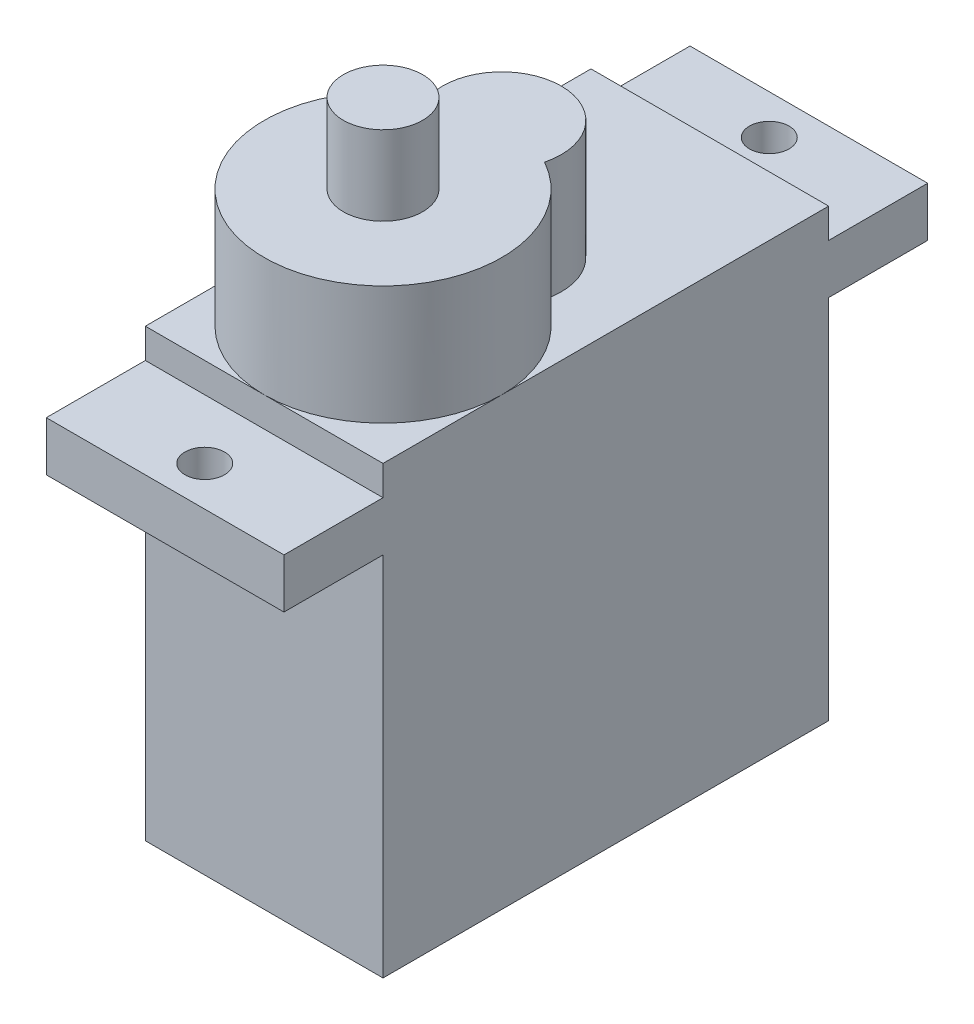
ISO-10303-21;
HEADER;
FILE_DESCRIPTION(('STEP AP214'),'2;1');
FILE_NAME('part.step','',(''),(''),'','','');
FILE_SCHEMA(('AUTOMOTIVE_DESIGN { 1 0 10303 214 1 1 1 1 }'));
ENDSEC;
DATA;
#1=APPLICATION_CONTEXT('core data for automotive mechanical design processes');
#2=APPLICATION_PROTOCOL_DEFINITION('international standard','automotive_design',2000,#1);
#3=PRODUCT_CONTEXT('',#1,'mechanical');
#4=PRODUCT('Part','Part','',(#3));
#5=PRODUCT_RELATED_PRODUCT_CATEGORY('part','',(#4));
#6=PRODUCT_DEFINITION_FORMATION('','',#4);
#7=PRODUCT_DEFINITION_CONTEXT('part definition',#1,'design');
#8=PRODUCT_DEFINITION('design','',#6,#7);
#9=PRODUCT_DEFINITION_SHAPE('','',#8);
#10=(LENGTH_UNIT() NAMED_UNIT(*) SI_UNIT(.MILLI.,.METRE.));
#11=(NAMED_UNIT(*) PLANE_ANGLE_UNIT() SI_UNIT($,.RADIAN.));
#12=(NAMED_UNIT(*) SI_UNIT($,.STERADIAN.) SOLID_ANGLE_UNIT());
#13=UNCERTAINTY_MEASURE_WITH_UNIT(LENGTH_MEASURE(1.E-05),#10,'distance_accuracy_value','');
#14=(GEOMETRIC_REPRESENTATION_CONTEXT(3) GLOBAL_UNCERTAINTY_ASSIGNED_CONTEXT((#13)) GLOBAL_UNIT_ASSIGNED_CONTEXT((#10,
#11,#12)) REPRESENTATION_CONTEXT('',''));
#15=CARTESIAN_POINT('',(0.,0.,0.));
#16=DIRECTION('',(0.,0.,1.));
#17=DIRECTION('',(1.,0.,0.));
#18=AXIS2_PLACEMENT_3D('',#15,#16,#17);
#19=CARTESIAN_POINT('',(12.,13.25,11.25));
#20=DIRECTION('',(0.,-1.,0.));
#21=DIRECTION('',(0.,0.,-1.));
#22=AXIS2_PLACEMENT_3D('',#19,#20,#21);
#23=PLANE('',#22);
#24=CARTESIAN_POINT('',(6.,13.25,-0.750000000000001));
#25=DIRECTION('',(0.,1.,0.));
#26=DIRECTION('',(0.,0.,1.));
#27=AXIS2_PLACEMENT_3D('',#24,#25,#26);
#28=CIRCLE('',#27,3.);
#29=CARTESIAN_POINT('',(8.90473750965556,13.25,0.));
#30=VERTEX_POINT('',#29);
#31=CARTESIAN_POINT('',(3.09526249034444,13.25,0.));
#32=VERTEX_POINT('',#31);
#33=EDGE_CURVE('E165',#30,#32,#28,.T.);
#34=ORIENTED_EDGE('',*,*,#33,.F.);
#35=CARTESIAN_POINT('',(6.,13.25,5.25));
#36=DIRECTION('',(0.,1.,0.));
#37=DIRECTION('',(0.,0.,1.));
#38=AXIS2_PLACEMENT_3D('',#35,#36,#37);
#39=CIRCLE('',#38,6.);
#40=CARTESIAN_POINT('',(12.,13.25,5.25));
#41=VERTEX_POINT('',#40);
#42=EDGE_CURVE('E60',#41,#30,#39,.T.);
#43=ORIENTED_EDGE('',*,*,#42,.F.);
#44=DIRECTION('',(0.,0.,1.));
#45=VECTOR('',#44,1.);
#46=CARTESIAN_POINT('',(12.,13.25,11.25));
#47=LINE('',#46,#45);
#48=CARTESIAN_POINT('',(12.,13.25,-11.25));
#49=VERTEX_POINT('',#48);
#50=EDGE_CURVE('E186',#49,#41,#47,.T.);
#51=ORIENTED_EDGE('',*,*,#50,.F.);
#52=DIRECTION('',(-1.,0.,0.));
#53=VECTOR('',#52,1.);
#54=CARTESIAN_POINT('',(12.,13.25,-11.25));
#55=LINE('',#54,#53);
#56=CARTESIAN_POINT('',(0.,13.25,-11.25));
#57=VERTEX_POINT('',#56);
#58=EDGE_CURVE('E244',#49,#57,#55,.T.);
#59=ORIENTED_EDGE('',*,*,#58,.T.);
#60=DIRECTION('',(0.,0.,1.));
#61=VECTOR('',#60,1.);
#62=CARTESIAN_POINT('',(0.,13.25,11.25));
#63=LINE('',#62,#61);
#64=CARTESIAN_POINT('',(0.,13.25,5.25));
#65=VERTEX_POINT('',#64);
#66=EDGE_CURVE('E210',#57,#65,#63,.T.);
#67=ORIENTED_EDGE('',*,*,#66,.T.);
#68=EDGE_CURVE('E48',#32,#65,#39,.T.);
#69=ORIENTED_EDGE('',*,*,#68,.F.);
#70=EDGE_LOOP('',(#34,#43,#51,#59,#67,#69));
#71=FACE_BOUND('',#70,.T.);
#72=ADVANCED_FACE('F37',(#71),#23,.F.);
#73=CARTESIAN_POINT('',(6.,13.25,11.25));
#74=VERTEX_POINT('',#73);
#75=EDGE_CURVE('E11',#65,#74,#39,.T.);
#76=ORIENTED_EDGE('',*,*,#75,.F.);
#77=CARTESIAN_POINT('',(0.,13.25,11.25));
#78=VERTEX_POINT('',#77);
#79=EDGE_CURVE('E209',#65,#78,#63,.T.);
#80=ORIENTED_EDGE('',*,*,#79,.T.);
#81=DIRECTION('',(-1.,0.,0.));
#82=VECTOR('',#81,1.);
#83=CARTESIAN_POINT('',(12.,13.25,11.25));
#84=LINE('',#83,#82);
#85=EDGE_CURVE('E240',#74,#78,#84,.T.);
#86=ORIENTED_EDGE('',*,*,#85,.F.);
#87=EDGE_LOOP('',(#76,#80,#86));
#88=FACE_BOUND('',#87,.T.);
#89=ADVANCED_FACE('F299',(#88),#23,.F.);
#90=CARTESIAN_POINT('',(12.,9.25,-11.25));
#91=DIRECTION('',(0.,0.,1.));
#92=DIRECTION('',(0.,-1.,0.));
#93=AXIS2_PLACEMENT_3D('',#90,#91,#92);
#94=PLANE('',#93);
#95=DIRECTION('',(0.,1.,0.));
#96=VECTOR('',#95,1.);
#97=CARTESIAN_POINT('',(0.,9.25,-11.25));
#98=LINE('',#97,#96);
#99=CARTESIAN_POINT('',(0.,-9.25,-11.25));
#100=VERTEX_POINT('',#99);
#101=CARTESIAN_POINT('',(0.,9.25,-11.25));
#102=VERTEX_POINT('',#101);
#103=EDGE_CURVE('E166',#100,#102,#98,.T.);
#104=ORIENTED_EDGE('',*,*,#103,.T.);
#105=DIRECTION('',(-1.,0.,0.));
#106=VECTOR('',#105,1.);
#107=CARTESIAN_POINT('',(12.,9.25,-11.25));
#108=LINE('',#107,#106);
#109=CARTESIAN_POINT('',(12.,9.25,-11.25));
#110=VERTEX_POINT('',#109);
#111=EDGE_CURVE('E255',#110,#102,#108,.T.);
#112=ORIENTED_EDGE('',*,*,#111,.F.);
#113=DIRECTION('',(0.,1.,0.));
#114=VECTOR('',#113,1.);
#115=CARTESIAN_POINT('',(12.,9.25,-11.25));
#116=LINE('',#115,#114);
#117=CARTESIAN_POINT('',(12.,-9.25,-11.25));
#118=VERTEX_POINT('',#117);
#119=EDGE_CURVE('E173',#118,#110,#116,.T.);
#120=ORIENTED_EDGE('',*,*,#119,.F.);
#121=DIRECTION('',(-1.,0.,0.));
#122=VECTOR('',#121,1.);
#123=CARTESIAN_POINT('',(12.,-9.25,-11.25));
#124=LINE('',#123,#122);
#125=EDGE_CURVE('E200',#118,#100,#124,.T.);
#126=ORIENTED_EDGE('',*,*,#125,.T.);
#127=EDGE_LOOP('',(#104,#112,#120,#126));
#128=FACE_BOUND('',#127,.T.);
#129=ADVANCED_FACE('F39',(#128),#94,.F.);
#130=CARTESIAN_POINT('',(12.,9.25,-11.25));
#131=DIRECTION('',(0.,1.,0.));
#132=DIRECTION('',(0.,0.,1.));
#133=AXIS2_PLACEMENT_3D('',#130,#131,#132);
#134=PLANE('',#133);
#135=CARTESIAN_POINT('',(6.,9.25,-14.25));
#136=DIRECTION('',(0.,1.,0.));
#137=DIRECTION('',(0.,0.,1.));
#138=AXIS2_PLACEMENT_3D('',#135,#136,#137);
#139=CIRCLE('',#138,1.);
#140=CARTESIAN_POINT('',(6.,9.25,-13.25));
#141=VERTEX_POINT('',#140);
#142=EDGE_CURVE('E267',#141,#141,#139,.T.);
#143=ORIENTED_EDGE('',*,*,#142,.T.);
#144=EDGE_LOOP('',(#143));
#145=FACE_BOUND('',#144,.T.);
#146=DIRECTION('',(0.,0.,-1.));
#147=VECTOR('',#146,1.);
#148=CARTESIAN_POINT('',(0.,9.25,-11.25));
#149=LINE('',#148,#147);
#150=CARTESIAN_POINT('',(0.,9.25,-16.25));
#151=VERTEX_POINT('',#150);
#152=EDGE_CURVE('E169',#102,#151,#149,.T.);
#153=ORIENTED_EDGE('',*,*,#152,.T.);
#154=DIRECTION('',(-1.,0.,0.));
#155=VECTOR('',#154,1.);
#156=CARTESIAN_POINT('',(12.,9.25,-16.25));
#157=LINE('',#156,#155);
#158=CARTESIAN_POINT('',(12.,9.25,-16.25));
#159=VERTEX_POINT('',#158);
#160=EDGE_CURVE('E253',#159,#151,#157,.T.);
#161=ORIENTED_EDGE('',*,*,#160,.F.);
#162=DIRECTION('',(0.,0.,-1.));
#163=VECTOR('',#162,1.);
#164=CARTESIAN_POINT('',(12.,9.25,-11.25));
#165=LINE('',#164,#163);
#166=EDGE_CURVE('E176',#110,#159,#165,.T.);
#167=ORIENTED_EDGE('',*,*,#166,.F.);
#168=ORIENTED_EDGE('',*,*,#111,.T.);
#169=EDGE_LOOP('',(#153,#161,#167,#168));
#170=FACE_BOUND('',#169,.T.);
#171=ADVANCED_FACE('F363',(#145,#170),#134,.F.);
#172=CARTESIAN_POINT('',(12.,11.75,-16.25));
#173=DIRECTION('',(0.,0.,1.));
#174=DIRECTION('',(0.,-1.,0.));
#175=AXIS2_PLACEMENT_3D('',#172,#173,#174);
#176=PLANE('',#175);
#177=DIRECTION('',(0.,1.,0.));
#178=VECTOR('',#177,1.);
#179=CARTESIAN_POINT('',(0.,11.75,-16.25));
#180=LINE('',#179,#178);
#181=CARTESIAN_POINT('',(0.,11.75,-16.25));
#182=VERTEX_POINT('',#181);
#183=EDGE_CURVE('E203',#151,#182,#180,.T.);
#184=ORIENTED_EDGE('',*,*,#183,.T.);
#185=DIRECTION('',(-1.,0.,0.));
#186=VECTOR('',#185,1.);
#187=CARTESIAN_POINT('',(12.,11.75,-16.25));
#188=LINE('',#187,#186);
#189=CARTESIAN_POINT('',(12.,11.75,-16.25));
#190=VERTEX_POINT('',#189);
#191=EDGE_CURVE('E250',#190,#182,#188,.T.);
#192=ORIENTED_EDGE('',*,*,#191,.F.);
#193=DIRECTION('',(0.,1.,0.));
#194=VECTOR('',#193,1.);
#195=CARTESIAN_POINT('',(12.,11.75,-16.25));
#196=LINE('',#195,#194);
#197=EDGE_CURVE('E179',#159,#190,#196,.T.);
#198=ORIENTED_EDGE('',*,*,#197,.F.);
#199=ORIENTED_EDGE('',*,*,#160,.T.);
#200=EDGE_LOOP('',(#184,#192,#198,#199));
#201=FACE_BOUND('',#200,.T.);
#202=ADVANCED_FACE('F366',(#201),#176,.F.);
#203=CARTESIAN_POINT('',(12.,11.75,-11.25));
#204=DIRECTION('',(0.,-1.,0.));
#205=DIRECTION('',(0.,0.,-1.));
#206=AXIS2_PLACEMENT_3D('',#203,#204,#205);
#207=PLANE('',#206);
#208=CARTESIAN_POINT('',(6.,11.75,-14.25));
#209=DIRECTION('',(0.,1.,0.));
#210=DIRECTION('',(0.,0.,1.));
#211=AXIS2_PLACEMENT_3D('',#208,#209,#210);
#212=CIRCLE('',#211,1.);
#213=CARTESIAN_POINT('',(6.,11.75,-13.25));
#214=VERTEX_POINT('',#213);
#215=EDGE_CURVE('E271',#214,#214,#212,.T.);
#216=ORIENTED_EDGE('',*,*,#215,.F.);
#217=EDGE_LOOP('',(#216));
#218=FACE_BOUND('',#217,.T.);
#219=DIRECTION('',(0.,0.,1.));
#220=VECTOR('',#219,1.);
#221=CARTESIAN_POINT('',(0.,11.75,-11.25));
#222=LINE('',#221,#220);
#223=CARTESIAN_POINT('',(0.,11.75,-11.25));
#224=VERTEX_POINT('',#223);
#225=EDGE_CURVE('E205',#182,#224,#222,.T.);
#226=ORIENTED_EDGE('',*,*,#225,.T.);
#227=DIRECTION('',(-1.,0.,0.));
#228=VECTOR('',#227,1.);
#229=CARTESIAN_POINT('',(12.,11.75,-11.25));
#230=LINE('',#229,#228);
#231=CARTESIAN_POINT('',(12.,11.75,-11.25));
#232=VERTEX_POINT('',#231);
#233=EDGE_CURVE('E247',#232,#224,#230,.T.);
#234=ORIENTED_EDGE('',*,*,#233,.F.);
#235=DIRECTION('',(0.,0.,1.));
#236=VECTOR('',#235,1.);
#237=CARTESIAN_POINT('',(12.,11.75,-11.25));
#238=LINE('',#237,#236);
#239=EDGE_CURVE('E181',#190,#232,#238,.T.);
#240=ORIENTED_EDGE('',*,*,#239,.F.);
#241=ORIENTED_EDGE('',*,*,#191,.T.);
#242=EDGE_LOOP('',(#226,#234,#240,#241));
#243=FACE_BOUND('',#242,.T.);
#244=ADVANCED_FACE('F318',(#218,#243),#207,.F.);
#245=CARTESIAN_POINT('',(12.,13.25,-11.25));
#246=DIRECTION('',(0.,0.,1.));
#247=DIRECTION('',(1.,0.,0.));
#248=AXIS2_PLACEMENT_3D('',#245,#246,#247);
#249=PLANE('',#248);
#250=DIRECTION('',(0.,1.,0.));
#251=VECTOR('',#250,1.);
#252=CARTESIAN_POINT('',(0.,13.25,-11.25));
#253=LINE('',#252,#251);
#254=EDGE_CURVE('E207',#224,#57,#253,.T.);
#255=ORIENTED_EDGE('',*,*,#254,.T.);
#256=ORIENTED_EDGE('',*,*,#58,.F.);
#257=DIRECTION('',(0.,1.,0.));
#258=VECTOR('',#257,1.);
#259=CARTESIAN_POINT('',(12.,13.25,-11.25));
#260=LINE('',#259,#258);
#261=EDGE_CURVE('E183',#232,#49,#260,.T.);
#262=ORIENTED_EDGE('',*,*,#261,.F.);
#263=ORIENTED_EDGE('',*,*,#233,.T.);
#264=EDGE_LOOP('',(#255,#256,#262,#263));
#265=FACE_BOUND('',#264,.T.);
#266=ADVANCED_FACE('F310',(#265),#249,.F.);
#267=EDGE_CURVE('E46',#74,#41,#39,.T.);
#268=ORIENTED_EDGE('',*,*,#267,.F.);
#269=CARTESIAN_POINT('',(12.,13.25,11.25));
#270=VERTEX_POINT('',#269);
#271=EDGE_CURVE('E241',#270,#74,#84,.T.);
#272=ORIENTED_EDGE('',*,*,#271,.F.);
#273=EDGE_CURVE('E185',#41,#270,#47,.T.);
#274=ORIENTED_EDGE('',*,*,#273,.F.);
#275=EDGE_LOOP('',(#268,#272,#274));
#276=FACE_BOUND('',#275,.T.);
#277=ADVANCED_FACE('F301',(#276),#23,.F.);
#278=CARTESIAN_POINT('',(12.,13.25,11.25));
#279=DIRECTION('',(0.,0.,-1.));
#280=DIRECTION('',(-1.,0.,0.));
#281=AXIS2_PLACEMENT_3D('',#278,#279,#280);
#282=PLANE('',#281);
#283=DIRECTION('',(0.,-1.,0.));
#284=VECTOR('',#283,1.);
#285=CARTESIAN_POINT('',(0.,13.25,11.25));
#286=LINE('',#285,#284);
#287=CARTESIAN_POINT('',(0.,11.75,11.25));
#288=VERTEX_POINT('',#287);
#289=EDGE_CURVE('E212',#78,#288,#286,.T.);
#290=ORIENTED_EDGE('',*,*,#289,.T.);
#291=DIRECTION('',(-1.,0.,0.));
#292=VECTOR('',#291,1.);
#293=CARTESIAN_POINT('',(12.,11.75,11.25));
#294=LINE('',#293,#292);
#295=CARTESIAN_POINT('',(12.,11.75,11.25));
#296=VERTEX_POINT('',#295);
#297=EDGE_CURVE('E237',#296,#288,#294,.T.);
#298=ORIENTED_EDGE('',*,*,#297,.F.);
#299=DIRECTION('',(0.,-1.,0.));
#300=VECTOR('',#299,1.);
#301=CARTESIAN_POINT('',(12.,13.25,11.25));
#302=LINE('',#301,#300);
#303=EDGE_CURVE('E189',#270,#296,#302,.T.);
#304=ORIENTED_EDGE('',*,*,#303,.F.);
#305=ORIENTED_EDGE('',*,*,#271,.T.);
#306=ORIENTED_EDGE('',*,*,#85,.T.);
#307=EDGE_LOOP('',(#290,#298,#304,#305,#306));
#308=FACE_BOUND('',#307,.T.);
#309=ADVANCED_FACE('F309',(#308),#282,.F.);
#310=CARTESIAN_POINT('',(12.,11.75,16.25));
#311=DIRECTION('',(0.,-1.,0.));
#312=DIRECTION('',(0.,0.,-1.));
#313=AXIS2_PLACEMENT_3D('',#310,#311,#312);
#314=PLANE('',#313);
#315=CARTESIAN_POINT('',(6.,11.75,14.25));
#316=DIRECTION('',(0.,1.,0.));
#317=DIRECTION('',(0.,0.,1.));
#318=AXIS2_PLACEMENT_3D('',#315,#316,#317);
#319=CIRCLE('',#318,1.);
#320=CARTESIAN_POINT('',(6.,11.75,15.25));
#321=VERTEX_POINT('',#320);
#322=EDGE_CURVE('E274',#321,#321,#319,.T.);
#323=ORIENTED_EDGE('',*,*,#322,.F.);
#324=EDGE_LOOP('',(#323));
#325=FACE_BOUND('',#324,.T.);
#326=DIRECTION('',(0.,0.,1.));
#327=VECTOR('',#326,1.);
#328=CARTESIAN_POINT('',(0.,11.75,16.25));
#329=LINE('',#328,#327);
#330=CARTESIAN_POINT('',(0.,11.75,16.25));
#331=VERTEX_POINT('',#330);
#332=EDGE_CURVE('E214',#288,#331,#329,.T.);
#333=ORIENTED_EDGE('',*,*,#332,.T.);
#334=DIRECTION('',(-1.,0.,0.));
#335=VECTOR('',#334,1.);
#336=CARTESIAN_POINT('',(12.,11.75,16.25));
#337=LINE('',#336,#335);
#338=CARTESIAN_POINT('',(12.,11.75,16.25));
#339=VERTEX_POINT('',#338);
#340=EDGE_CURVE('E234',#339,#331,#337,.T.);
#341=ORIENTED_EDGE('',*,*,#340,.F.);
#342=DIRECTION('',(0.,0.,1.));
#343=VECTOR('',#342,1.);
#344=CARTESIAN_POINT('',(12.,11.75,16.25));
#345=LINE('',#344,#343);
#346=EDGE_CURVE('E191',#296,#339,#345,.T.);
#347=ORIENTED_EDGE('',*,*,#346,.F.);
#348=ORIENTED_EDGE('',*,*,#297,.T.);
#349=EDGE_LOOP('',(#333,#341,#347,#348));
#350=FACE_BOUND('',#349,.T.);
#351=ADVANCED_FACE('F316',(#325,#350),#314,.F.);
#352=CARTESIAN_POINT('',(12.,11.75,16.25));
#353=DIRECTION('',(0.,0.,-1.));
#354=DIRECTION('',(-1.,0.,0.));
#355=AXIS2_PLACEMENT_3D('',#352,#353,#354);
#356=PLANE('',#355);
#357=DIRECTION('',(0.,-1.,0.));
#358=VECTOR('',#357,1.);
#359=CARTESIAN_POINT('',(0.,11.75,16.25));
#360=LINE('',#359,#358);
#361=CARTESIAN_POINT('',(0.,9.25,16.25));
#362=VERTEX_POINT('',#361);
#363=EDGE_CURVE('E216',#331,#362,#360,.T.);
#364=ORIENTED_EDGE('',*,*,#363,.T.);
#365=DIRECTION('',(-1.,0.,0.));
#366=VECTOR('',#365,1.);
#367=CARTESIAN_POINT('',(12.,9.25,16.25));
#368=LINE('',#367,#366);
#369=CARTESIAN_POINT('',(12.,9.25,16.25));
#370=VERTEX_POINT('',#369);
#371=EDGE_CURVE('E231',#370,#362,#368,.T.);
#372=ORIENTED_EDGE('',*,*,#371,.F.);
#373=DIRECTION('',(0.,-1.,0.));
#374=VECTOR('',#373,1.);
#375=CARTESIAN_POINT('',(12.,11.75,16.25));
#376=LINE('',#375,#374);
#377=EDGE_CURVE('E193',#339,#370,#376,.T.);
#378=ORIENTED_EDGE('',*,*,#377,.F.);
#379=ORIENTED_EDGE('',*,*,#340,.T.);
#380=EDGE_LOOP('',(#364,#372,#378,#379));
#381=FACE_BOUND('',#380,.T.);
#382=ADVANCED_FACE('F345',(#381),#356,.F.);
#383=CARTESIAN_POINT('',(12.,9.25,16.25));
#384=DIRECTION('',(0.,1.,0.));
#385=DIRECTION('',(0.,0.,1.));
#386=AXIS2_PLACEMENT_3D('',#383,#384,#385);
#387=PLANE('',#386);
#388=CARTESIAN_POINT('',(6.,9.25,14.25));
#389=DIRECTION('',(0.,1.,0.));
#390=DIRECTION('',(0.,0.,1.));
#391=AXIS2_PLACEMENT_3D('',#388,#389,#390);
#392=CIRCLE('',#391,1.);
#393=CARTESIAN_POINT('',(6.,9.25,15.25));
#394=VERTEX_POINT('',#393);
#395=EDGE_CURVE('E41',#394,#394,#392,.T.);
#396=ORIENTED_EDGE('',*,*,#395,.T.);
#397=EDGE_LOOP('',(#396));
#398=FACE_BOUND('',#397,.T.);
#399=DIRECTION('',(0.,0.,-1.));
#400=VECTOR('',#399,1.);
#401=CARTESIAN_POINT('',(0.,9.25,16.25));
#402=LINE('',#401,#400);
#403=CARTESIAN_POINT('',(0.,9.25,11.25));
#404=VERTEX_POINT('',#403);
#405=EDGE_CURVE('E218',#362,#404,#402,.T.);
#406=ORIENTED_EDGE('',*,*,#405,.T.);
#407=DIRECTION('',(-1.,0.,0.));
#408=VECTOR('',#407,1.);
#409=CARTESIAN_POINT('',(12.,9.25,11.25));
#410=LINE('',#409,#408);
#411=CARTESIAN_POINT('',(12.,9.25,11.25));
#412=VERTEX_POINT('',#411);
#413=EDGE_CURVE('E228',#412,#404,#410,.T.);
#414=ORIENTED_EDGE('',*,*,#413,.F.);
#415=DIRECTION('',(0.,0.,-1.));
#416=VECTOR('',#415,1.);
#417=CARTESIAN_POINT('',(12.,9.25,16.25));
#418=LINE('',#417,#416);
#419=EDGE_CURVE('E195',#370,#412,#418,.T.);
#420=ORIENTED_EDGE('',*,*,#419,.F.);
#421=ORIENTED_EDGE('',*,*,#371,.T.);
#422=EDGE_LOOP('',(#406,#414,#420,#421));
#423=FACE_BOUND('',#422,.T.);
#424=ADVANCED_FACE('F281',(#398,#423),#387,.F.);
#425=CARTESIAN_POINT('',(12.,9.25,11.25));
#426=DIRECTION('',(0.,0.,-1.));
#427=DIRECTION('',(0.,1.,0.));
#428=AXIS2_PLACEMENT_3D('',#425,#426,#427);
#429=PLANE('',#428);
#430=DIRECTION('',(0.,-1.,0.));
#431=VECTOR('',#430,1.);
#432=CARTESIAN_POINT('',(0.,9.25,11.25));
#433=LINE('',#432,#431);
#434=CARTESIAN_POINT('',(0.,-9.25,11.25));
#435=VERTEX_POINT('',#434);
#436=EDGE_CURVE('E220',#404,#435,#433,.T.);
#437=ORIENTED_EDGE('',*,*,#436,.T.);
#438=DIRECTION('',(-1.,0.,0.));
#439=VECTOR('',#438,1.);
#440=CARTESIAN_POINT('',(12.,-9.25,11.25));
#441=LINE('',#440,#439);
#442=CARTESIAN_POINT('',(12.,-9.25,11.25));
#443=VERTEX_POINT('',#442);
#444=EDGE_CURVE('E225',#443,#435,#441,.T.);
#445=ORIENTED_EDGE('',*,*,#444,.F.);
#446=DIRECTION('',(0.,-1.,0.));
#447=VECTOR('',#446,1.);
#448=CARTESIAN_POINT('',(12.,9.25,11.25));
#449=LINE('',#448,#447);
#450=EDGE_CURVE('E197',#412,#443,#449,.T.);
#451=ORIENTED_EDGE('',*,*,#450,.F.);
#452=ORIENTED_EDGE('',*,*,#413,.T.);
#453=EDGE_LOOP('',(#437,#445,#451,#452));
#454=FACE_BOUND('',#453,.T.);
#455=ADVANCED_FACE('F353',(#454),#429,.F.);
#456=CARTESIAN_POINT('',(12.,-9.25,11.25));
#457=DIRECTION('',(0.,1.,0.));
#458=DIRECTION('',(0.,0.,1.));
#459=AXIS2_PLACEMENT_3D('',#456,#457,#458);
#460=PLANE('',#459);
#461=DIRECTION('',(0.,0.,-1.));
#462=VECTOR('',#461,1.);
#463=CARTESIAN_POINT('',(0.,-9.25,11.25));
#464=LINE('',#463,#462);
#465=EDGE_CURVE('E177',#435,#100,#464,.T.);
#466=ORIENTED_EDGE('',*,*,#465,.T.);
#467=ORIENTED_EDGE('',*,*,#125,.F.);
#468=DIRECTION('',(0.,0.,-1.));
#469=VECTOR('',#468,1.);
#470=CARTESIAN_POINT('',(12.,-9.25,11.25));
#471=LINE('',#470,#469);
#472=EDGE_CURVE('E199',#443,#118,#471,.T.);
#473=ORIENTED_EDGE('',*,*,#472,.F.);
#474=ORIENTED_EDGE('',*,*,#444,.T.);
#475=EDGE_LOOP('',(#466,#467,#473,#474));
#476=FACE_BOUND('',#475,.T.);
#477=ADVANCED_FACE('F358',(#476),#460,.F.);
#478=CARTESIAN_POINT('',(12.,0.,0.));
#479=DIRECTION('',(1.,0.,0.));
#480=DIRECTION('',(0.,0.,-1.));
#481=AXIS2_PLACEMENT_3D('',#478,#479,#480);
#482=PLANE('',#481);
#483=ORIENTED_EDGE('',*,*,#119,.T.);
#484=ORIENTED_EDGE('',*,*,#166,.T.);
#485=ORIENTED_EDGE('',*,*,#197,.T.);
#486=ORIENTED_EDGE('',*,*,#239,.T.);
#487=ORIENTED_EDGE('',*,*,#261,.T.);
#488=ORIENTED_EDGE('',*,*,#50,.T.);
#489=ORIENTED_EDGE('',*,*,#273,.T.);
#490=ORIENTED_EDGE('',*,*,#303,.T.);
#491=ORIENTED_EDGE('',*,*,#346,.T.);
#492=ORIENTED_EDGE('',*,*,#377,.T.);
#493=ORIENTED_EDGE('',*,*,#419,.T.);
#494=ORIENTED_EDGE('',*,*,#450,.T.);
#495=ORIENTED_EDGE('',*,*,#472,.T.);
#496=EDGE_LOOP('',(#483,#484,#485,#486,#487,#488,#489,#490,#491,#492,#493,#494,#495));
#497=FACE_BOUND('',#496,.T.);
#498=ADVANCED_FACE('F329',(#497),#482,.T.);
#499=CARTESIAN_POINT('',(0.,0.,0.));
#500=DIRECTION('',(1.,0.,0.));
#501=DIRECTION('',(0.,0.,-1.));
#502=AXIS2_PLACEMENT_3D('',#499,#500,#501);
#503=PLANE('',#502);
#504=ORIENTED_EDGE('',*,*,#103,.F.);
#505=ORIENTED_EDGE('',*,*,#465,.F.);
#506=ORIENTED_EDGE('',*,*,#436,.F.);
#507=ORIENTED_EDGE('',*,*,#405,.F.);
#508=ORIENTED_EDGE('',*,*,#363,.F.);
#509=ORIENTED_EDGE('',*,*,#332,.F.);
#510=ORIENTED_EDGE('',*,*,#289,.F.);
#511=ORIENTED_EDGE('',*,*,#79,.F.);
#512=ORIENTED_EDGE('',*,*,#66,.F.);
#513=ORIENTED_EDGE('',*,*,#254,.F.);
#514=ORIENTED_EDGE('',*,*,#225,.F.);
#515=ORIENTED_EDGE('',*,*,#183,.F.);
#516=ORIENTED_EDGE('',*,*,#152,.F.);
#517=EDGE_LOOP('',(#504,#505,#506,#507,#508,#509,#510,#511,#512,#513,#514,#515,#516));
#518=FACE_BOUND('',#517,.T.);
#519=ADVANCED_FACE('F337',(#518),#503,.F.);
#520=CARTESIAN_POINT('',(6.,19.25,-0.750000000000001));
#521=DIRECTION('',(0.,-1.,0.));
#522=DIRECTION('',(0.,0.,-1.));
#523=AXIS2_PLACEMENT_3D('',#520,#521,#522);
#524=CYLINDRICAL_SURFACE('',#523,3.);
#525=ORIENTED_EDGE('',*,*,#33,.T.);
#526=DIRECTION('',(0.,-1.,0.));
#527=VECTOR('',#526,1.);
#528=CARTESIAN_POINT('',(3.09526249034444,19.25,0.));
#529=LINE('',#528,#527);
#530=CARTESIAN_POINT('',(3.09526249034444,19.25,0.));
#531=VERTEX_POINT('',#530);
#532=EDGE_CURVE('E153',#531,#32,#529,.T.);
#533=ORIENTED_EDGE('',*,*,#532,.F.);
#534=CARTESIAN_POINT('',(6.,19.25,-0.750000000000001));
#535=DIRECTION('',(0.,1.,0.));
#536=DIRECTION('',(0.,0.,1.));
#537=AXIS2_PLACEMENT_3D('',#534,#535,#536);
#538=CIRCLE('',#537,3.);
#539=CARTESIAN_POINT('',(8.90473750965556,19.25,0.));
#540=VERTEX_POINT('',#539);
#541=EDGE_CURVE('E159',#540,#531,#538,.T.);
#542=ORIENTED_EDGE('',*,*,#541,.F.);
#543=DIRECTION('',(0.,-1.,0.));
#544=VECTOR('',#543,1.);
#545=CARTESIAN_POINT('',(8.90473750965556,19.25,0.));
#546=LINE('',#545,#544);
#547=EDGE_CURVE('E156',#540,#30,#546,.T.);
#548=ORIENTED_EDGE('',*,*,#547,.T.);
#549=EDGE_LOOP('',(#525,#533,#542,#548));
#550=FACE_BOUND('',#549,.T.);
#551=ADVANCED_FACE('F164',(#550),#524,.T.);
#552=CARTESIAN_POINT('',(6.,19.25,5.25));
#553=DIRECTION('',(0.,-1.,0.));
#554=DIRECTION('',(0.,0.,-1.));
#555=AXIS2_PLACEMENT_3D('',#552,#553,#554);
#556=CYLINDRICAL_SURFACE('',#555,6.);
#557=ORIENTED_EDGE('',*,*,#68,.T.);
#558=ORIENTED_EDGE('',*,*,#75,.T.);
#559=ORIENTED_EDGE('',*,*,#267,.T.);
#560=ORIENTED_EDGE('',*,*,#42,.T.);
#561=ORIENTED_EDGE('',*,*,#547,.F.);
#562=CARTESIAN_POINT('',(6.,19.25,5.25));
#563=DIRECTION('',(0.,1.,0.));
#564=DIRECTION('',(0.,0.,1.));
#565=AXIS2_PLACEMENT_3D('',#562,#563,#564);
#566=CIRCLE('',#565,6.);
#567=EDGE_CURVE('E149',#531,#540,#566,.T.);
#568=ORIENTED_EDGE('',*,*,#567,.F.);
#569=ORIENTED_EDGE('',*,*,#532,.T.);
#570=EDGE_LOOP('',(#557,#558,#559,#560,#561,#568,#569));
#571=FACE_BOUND('',#570,.T.);
#572=ADVANCED_FACE('F151',(#571),#556,.T.);
#573=CARTESIAN_POINT('',(6.,19.25,2.25));
#574=DIRECTION('',(0.,1.,0.));
#575=DIRECTION('',(0.,0.,1.));
#576=AXIS2_PLACEMENT_3D('',#573,#574,#575);
#577=PLANE('',#576);
#578=CARTESIAN_POINT('',(6.,19.25,5.25));
#579=DIRECTION('',(0.,1.,0.));
#580=DIRECTION('',(0.,0.,1.));
#581=AXIS2_PLACEMENT_3D('',#578,#579,#580);
#582=CIRCLE('',#581,2.);
#583=CARTESIAN_POINT('',(6.,19.25,7.25));
#584=VERTEX_POINT('',#583);
#585=EDGE_CURVE('E263',#584,#584,#582,.T.);
#586=ORIENTED_EDGE('',*,*,#585,.F.);
#587=EDGE_LOOP('',(#586));
#588=FACE_BOUND('',#587,.T.);
#589=ORIENTED_EDGE('',*,*,#541,.T.);
#590=ORIENTED_EDGE('',*,*,#567,.T.);
#591=EDGE_LOOP('',(#589,#590));
#592=FACE_BOUND('',#591,.T.);
#593=ADVANCED_FACE('F161',(#588,#592),#577,.T.);
#594=CARTESIAN_POINT('',(6.,23.25,5.25));
#595=DIRECTION('',(0.,-1.,0.));
#596=DIRECTION('',(0.,0.,-1.));
#597=AXIS2_PLACEMENT_3D('',#594,#595,#596);
#598=CYLINDRICAL_SURFACE('',#597,2.);
#599=CARTESIAN_POINT('',(6.,23.25,5.25));
#600=DIRECTION('',(0.,1.,0.));
#601=DIRECTION('',(0.,0.,1.));
#602=AXIS2_PLACEMENT_3D('',#599,#600,#601);
#603=CIRCLE('',#602,2.);
#604=CARTESIAN_POINT('',(6.,23.25,7.25));
#605=VERTEX_POINT('',#604);
#606=EDGE_CURVE('E261',#605,#605,#603,.T.);
#607=ORIENTED_EDGE('',*,*,#606,.F.);
#608=EDGE_LOOP('',(#607));
#609=FACE_BOUND('',#608,.T.);
#610=ORIENTED_EDGE('',*,*,#585,.T.);
#611=EDGE_LOOP('',(#610));
#612=FACE_BOUND('',#611,.T.);
#613=ADVANCED_FACE('F295',(#609,#612),#598,.T.);
#614=CARTESIAN_POINT('',(6.,23.25,5.25));
#615=DIRECTION('',(0.,1.,0.));
#616=DIRECTION('',(0.,0.,1.));
#617=AXIS2_PLACEMENT_3D('',#614,#615,#616);
#618=PLANE('',#617);
#619=ORIENTED_EDGE('',*,*,#606,.T.);
#620=EDGE_LOOP('',(#619));
#621=FACE_BOUND('',#620,.T.);
#622=ADVANCED_FACE('F287',(#621),#618,.T.);
#623=CARTESIAN_POINT('',(6.,-9.25000000000001,14.25));
#624=DIRECTION('',(0.,1.,0.));
#625=DIRECTION('',(0.,0.,1.));
#626=AXIS2_PLACEMENT_3D('',#623,#624,#625);
#627=CYLINDRICAL_SURFACE('',#626,1.);
#628=ORIENTED_EDGE('',*,*,#322,.T.);
#629=EDGE_LOOP('',(#628));
#630=FACE_BOUND('',#629,.T.);
#631=ORIENTED_EDGE('',*,*,#395,.F.);
#632=EDGE_LOOP('',(#631));
#633=FACE_BOUND('',#632,.T.);
#634=ADVANCED_FACE('F284',(#630,#633),#627,.F.);
#635=CARTESIAN_POINT('',(6.,-9.25000000000001,-14.25));
#636=DIRECTION('',(0.,1.,0.));
#637=DIRECTION('',(0.,0.,1.));
#638=AXIS2_PLACEMENT_3D('',#635,#636,#637);
#639=CYLINDRICAL_SURFACE('',#638,1.);
#640=ORIENTED_EDGE('',*,*,#215,.T.);
#641=EDGE_LOOP('',(#640));
#642=FACE_BOUND('',#641,.T.);
#643=ORIENTED_EDGE('',*,*,#142,.F.);
#644=EDGE_LOOP('',(#643));
#645=FACE_BOUND('',#644,.T.);
#646=ADVANCED_FACE('F286',(#642,#645),#639,.F.);
#647=CLOSED_SHELL('',(#72,#89,#129,#171,#202,#244,#266,#277,#309,#351,#382,#424,#455,#477,#498,
#519,#551,#572,#593,#613,#622,#634,#646));
#648=MANIFOLD_SOLID_BREP('B2',#647);
#649=ADVANCED_BREP_SHAPE_REPRESENTATION('',(#18,#648),#14);
#650=SHAPE_DEFINITION_REPRESENTATION(#9,#649);
ENDSEC;
END-ISO-10303-21;
